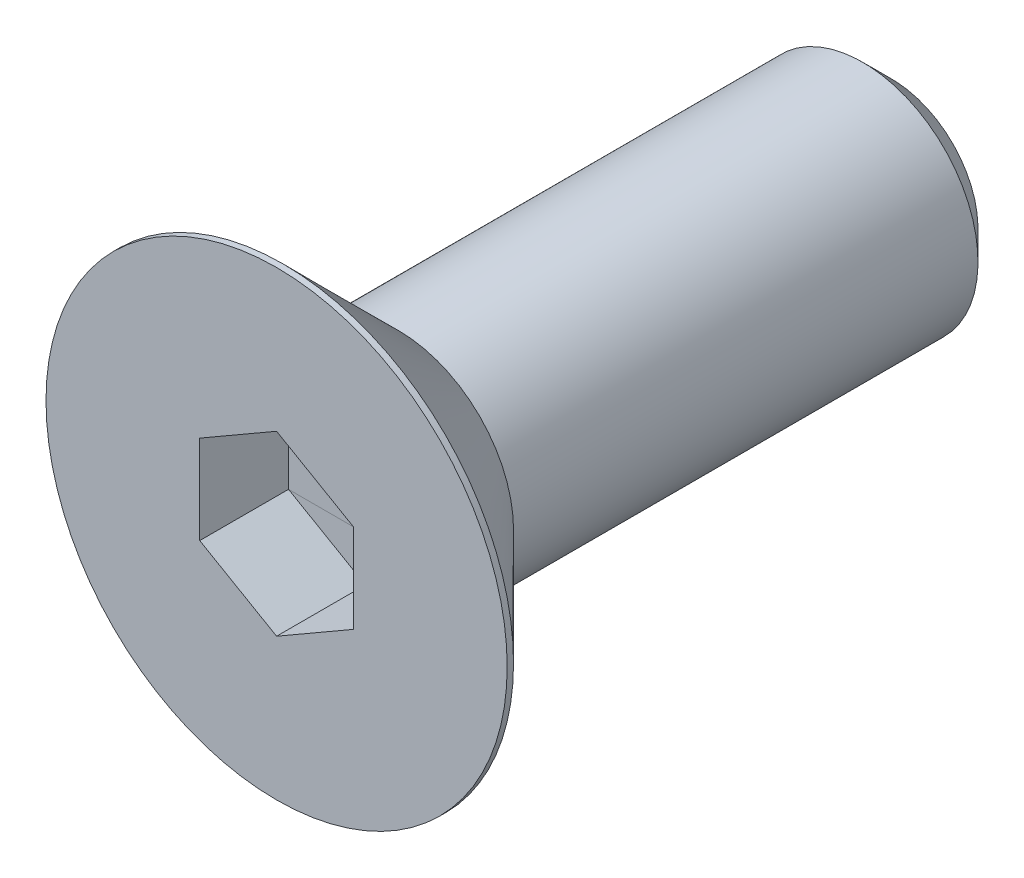
ISO-10303-21;
HEADER;
FILE_DESCRIPTION(('STEP AP214'),'2;1');
FILE_NAME('part.step','',(''),(''),'','','');
FILE_SCHEMA(('AUTOMOTIVE_DESIGN { 1 0 10303 214 1 1 1 1 }'));
ENDSEC;
DATA;
#1=APPLICATION_CONTEXT('core data for automotive mechanical design processes');
#2=APPLICATION_PROTOCOL_DEFINITION('international standard','automotive_design',2000,#1);
#3=PRODUCT_CONTEXT('',#1,'mechanical');
#4=PRODUCT('Part','Part','',(#3));
#5=PRODUCT_RELATED_PRODUCT_CATEGORY('part','',(#4));
#6=PRODUCT_DEFINITION_FORMATION('','',#4);
#7=PRODUCT_DEFINITION_CONTEXT('part definition',#1,'design');
#8=PRODUCT_DEFINITION('design','',#6,#7);
#9=PRODUCT_DEFINITION_SHAPE('','',#8);
#10=(LENGTH_UNIT() NAMED_UNIT(*) SI_UNIT(.MILLI.,.METRE.));
#11=(NAMED_UNIT(*) PLANE_ANGLE_UNIT() SI_UNIT($,.RADIAN.));
#12=(NAMED_UNIT(*) SI_UNIT($,.STERADIAN.) SOLID_ANGLE_UNIT());
#13=UNCERTAINTY_MEASURE_WITH_UNIT(LENGTH_MEASURE(1.E-05),#10,'distance_accuracy_value','');
#14=(GEOMETRIC_REPRESENTATION_CONTEXT(3) GLOBAL_UNCERTAINTY_ASSIGNED_CONTEXT((#13)) GLOBAL_UNIT_ASSIGNED_CONTEXT((#10,
#11,#12)) REPRESENTATION_CONTEXT('',''));
#15=CARTESIAN_POINT('',(0.,0.,0.));
#16=DIRECTION('',(0.,0.,1.));
#17=DIRECTION('',(1.,0.,0.));
#18=AXIS2_PLACEMENT_3D('',#15,#16,#17);
#19=CARTESIAN_POINT('',(0.,0.,7.835));
#20=DIRECTION('',(0.,0.,1.));
#21=DIRECTION('',(0.,-1.,0.));
#22=AXIS2_PLACEMENT_3D('',#19,#20,#21);
#23=CONICAL_SURFACE('',#22,6.,0.785398163397448);
#24=CARTESIAN_POINT('',(0.,0.,4.7));
#25=DIRECTION('',(0.,0.,1.));
#26=DIRECTION('',(0.,-1.,0.));
#27=AXIS2_PLACEMENT_3D('',#24,#25,#26);
#28=CIRCLE('',#27,2.865);
#29=CARTESIAN_POINT('',(0.,-2.865,4.7));
#30=VERTEX_POINT('',#29);
#31=EDGE_CURVE('E150',#30,#30,#28,.T.);
#32=ORIENTED_EDGE('',*,*,#31,.T.);
#33=EDGE_LOOP('',(#32));
#34=FACE_BOUND('',#33,.T.);
#35=CARTESIAN_POINT('',(0.,0.,7.835));
#36=DIRECTION('',(0.,0.,1.));
#37=DIRECTION('',(0.,-1.,0.));
#38=AXIS2_PLACEMENT_3D('',#35,#36,#37);
#39=CIRCLE('',#38,6.);
#40=CARTESIAN_POINT('',(0.,-6.,7.835));
#41=VERTEX_POINT('',#40);
#42=EDGE_CURVE('E12',#41,#41,#39,.T.);
#43=ORIENTED_EDGE('',*,*,#42,.F.);
#44=EDGE_LOOP('',(#43));
#45=FACE_BOUND('',#44,.T.);
#46=ADVANCED_FACE('F49',(#34,#45),#23,.T.);
#47=CARTESIAN_POINT('',(0.,0.,8.));
#48=DIRECTION('',(0.,0.,1.));
#49=DIRECTION('',(0.,-1.,0.));
#50=AXIS2_PLACEMENT_3D('',#47,#48,#49);
#51=CYLINDRICAL_SURFACE('',#50,6.);
#52=ORIENTED_EDGE('',*,*,#42,.T.);
#53=EDGE_LOOP('',(#52));
#54=FACE_BOUND('',#53,.T.);
#55=CARTESIAN_POINT('',(0.,0.,8.));
#56=DIRECTION('',(0.,0.,1.));
#57=DIRECTION('',(0.,-1.,0.));
#58=AXIS2_PLACEMENT_3D('',#55,#56,#57);
#59=CIRCLE('',#58,6.);
#60=CARTESIAN_POINT('',(0.,-6.,8.));
#61=VERTEX_POINT('',#60);
#62=EDGE_CURVE('E56',#61,#61,#59,.T.);
#63=ORIENTED_EDGE('',*,*,#62,.F.);
#64=EDGE_LOOP('',(#63));
#65=FACE_BOUND('',#64,.T.);
#66=ADVANCED_FACE('F162',(#54,#65),#51,.T.);
#67=CARTESIAN_POINT('',(0.,0.,8.));
#68=DIRECTION('',(0.,0.,-1.));
#69=DIRECTION('',(0.,1.,0.));
#70=AXIS2_PLACEMENT_3D('',#67,#68,#69);
#71=PLANE('',#70);
#72=DIRECTION('',(0.,1.,0.));
#73=VECTOR('',#72,1.);
#74=CARTESIAN_POINT('',(2.,-1.15470053837925,8.));
#75=LINE('',#74,#73);
#76=CARTESIAN_POINT('',(2.,-1.15470053837925,8.));
#77=VERTEX_POINT('',#76);
#78=CARTESIAN_POINT('',(2.,1.15470053837925,8.));
#79=VERTEX_POINT('',#78);
#80=EDGE_CURVE('E137',#77,#79,#75,.T.);
#81=ORIENTED_EDGE('',*,*,#80,.F.);
#82=DIRECTION('',(0.866025403784438,0.500000000000001,0.));
#83=VECTOR('',#82,1.);
#84=CARTESIAN_POINT('',(0.,-2.3094010767585,8.));
#85=LINE('',#84,#83);
#86=CARTESIAN_POINT('',(0.,-2.3094010767585,8.));
#87=VERTEX_POINT('',#86);
#88=EDGE_CURVE('E63',#87,#77,#85,.T.);
#89=ORIENTED_EDGE('',*,*,#88,.F.);
#90=DIRECTION('',(0.866025403784438,-0.5,0.));
#91=VECTOR('',#90,1.);
#92=CARTESIAN_POINT('',(-1.99999999999999,-1.15470053837925,8.));
#93=LINE('',#92,#91);
#94=CARTESIAN_POINT('',(-1.99999999999999,-1.15470053837925,8.));
#95=VERTEX_POINT('',#94);
#96=EDGE_CURVE('E146',#95,#87,#93,.T.);
#97=ORIENTED_EDGE('',*,*,#96,.F.);
#98=DIRECTION('',(0.,-1.,0.));
#99=VECTOR('',#98,1.);
#100=CARTESIAN_POINT('',(-1.99999999999999,1.15470053837925,8.));
#101=LINE('',#100,#99);
#102=CARTESIAN_POINT('',(-1.99999999999999,1.15470053837925,8.));
#103=VERTEX_POINT('',#102);
#104=EDGE_CURVE('E144',#103,#95,#101,.T.);
#105=ORIENTED_EDGE('',*,*,#104,.F.);
#106=DIRECTION('',(-0.866025403784439,-0.5,0.));
#107=VECTOR('',#106,1.);
#108=CARTESIAN_POINT('',(0.,2.3094010767585,8.));
#109=LINE('',#108,#107);
#110=CARTESIAN_POINT('',(0.,2.3094010767585,8.));
#111=VERTEX_POINT('',#110);
#112=EDGE_CURVE('E111',#111,#103,#109,.T.);
#113=ORIENTED_EDGE('',*,*,#112,.F.);
#114=DIRECTION('',(-0.866025403784439,0.5,0.));
#115=VECTOR('',#114,1.);
#116=CARTESIAN_POINT('',(2.,1.15470053837925,8.));
#117=LINE('',#116,#115);
#118=EDGE_CURVE('E140',#79,#111,#117,.T.);
#119=ORIENTED_EDGE('',*,*,#118,.F.);
#120=EDGE_LOOP('',(#81,#89,#97,#105,#113,#119));
#121=FACE_BOUND('',#120,.T.);
#122=ORIENTED_EDGE('',*,*,#62,.T.);
#123=EDGE_LOOP('',(#122));
#124=FACE_BOUND('',#123,.T.);
#125=ADVANCED_FACE('F160',(#121,#124),#71,.F.);
#126=CARTESIAN_POINT('',(0.,0.,4.7));
#127=DIRECTION('',(0.,0.,-1.));
#128=DIRECTION('',(0.,1.,0.));
#129=AXIS2_PLACEMENT_3D('',#126,#127,#128);
#130=PLANE('',#129);
#131=ORIENTED_EDGE('',*,*,#31,.F.);
#132=EDGE_LOOP('',(#131));
#133=FACE_BOUND('',#132,.T.);
#134=ADVANCED_FACE('F169',(#133),#130,.T.);
#135=CARTESIAN_POINT('',(0.,-2.3094010767585,5.69));
#136=DIRECTION('',(0.500000000000001,-0.866025403784438,0.));
#137=DIRECTION('',(0.866025403784438,0.500000000000001,0.));
#138=AXIS2_PLACEMENT_3D('',#135,#136,#137);
#139=PLANE('',#138);
#140=ORIENTED_EDGE('',*,*,#88,.T.);
#141=DIRECTION('',(0.,0.,1.));
#142=VECTOR('',#141,1.);
#143=CARTESIAN_POINT('',(2.,-1.15470053837925,5.69));
#144=LINE('',#143,#142);
#145=CARTESIAN_POINT('',(2.,-1.15470053837925,5.69));
#146=VERTEX_POINT('',#145);
#147=EDGE_CURVE('E93',#146,#77,#144,.T.);
#148=ORIENTED_EDGE('',*,*,#147,.F.);
#149=DIRECTION('',(0.866025403784438,0.500000000000001,0.));
#150=VECTOR('',#149,1.);
#151=CARTESIAN_POINT('',(0.,-2.3094010767585,5.69));
#152=LINE('',#151,#150);
#153=CARTESIAN_POINT('',(0.,-2.3094010767585,5.69));
#154=VERTEX_POINT('',#153);
#155=EDGE_CURVE('E148',#154,#146,#152,.T.);
#156=ORIENTED_EDGE('',*,*,#155,.F.);
#157=DIRECTION('',(0.,0.,1.));
#158=VECTOR('',#157,1.);
#159=CARTESIAN_POINT('',(0.,-2.3094010767585,5.69));
#160=LINE('',#159,#158);
#161=EDGE_CURVE('E71',#154,#87,#160,.T.);
#162=ORIENTED_EDGE('',*,*,#161,.T.);
#163=EDGE_LOOP('',(#140,#148,#156,#162));
#164=FACE_BOUND('',#163,.T.);
#165=ADVANCED_FACE('F176',(#164),#139,.F.);
#166=CARTESIAN_POINT('',(-1.99999999999999,-1.15470053837925,5.69));
#167=DIRECTION('',(-0.5,-0.866025403784439,0.));
#168=DIRECTION('',(0.866025403784439,-0.5,0.));
#169=AXIS2_PLACEMENT_3D('',#166,#167,#168);
#170=PLANE('',#169);
#171=ORIENTED_EDGE('',*,*,#96,.T.);
#172=ORIENTED_EDGE('',*,*,#161,.F.);
#173=DIRECTION('',(0.866025403784438,-0.5,0.));
#174=VECTOR('',#173,1.);
#175=CARTESIAN_POINT('',(-1.99999999999999,-1.15470053837925,5.69));
#176=LINE('',#175,#174);
#177=CARTESIAN_POINT('',(-1.99999999999999,-1.15470053837925,5.69));
#178=VERTEX_POINT('',#177);
#179=EDGE_CURVE('E123',#178,#154,#176,.T.);
#180=ORIENTED_EDGE('',*,*,#179,.F.);
#181=DIRECTION('',(0.,0.,1.));
#182=VECTOR('',#181,1.);
#183=CARTESIAN_POINT('',(-1.99999999999999,-1.15470053837925,5.69));
#184=LINE('',#183,#182);
#185=EDGE_CURVE('E115',#178,#95,#184,.T.);
#186=ORIENTED_EDGE('',*,*,#185,.T.);
#187=EDGE_LOOP('',(#171,#172,#180,#186));
#188=FACE_BOUND('',#187,.T.);
#189=ADVANCED_FACE('F180',(#188),#170,.F.);
#190=CARTESIAN_POINT('',(-1.99999999999999,1.15470053837925,5.69));
#191=DIRECTION('',(-1.,0.,0.));
#192=DIRECTION('',(0.,-1.,0.));
#193=AXIS2_PLACEMENT_3D('',#190,#191,#192);
#194=PLANE('',#193);
#195=ORIENTED_EDGE('',*,*,#104,.T.);
#196=ORIENTED_EDGE('',*,*,#185,.F.);
#197=DIRECTION('',(0.,-1.,0.));
#198=VECTOR('',#197,1.);
#199=CARTESIAN_POINT('',(-1.99999999999999,1.15470053837925,5.69));
#200=LINE('',#199,#198);
#201=CARTESIAN_POINT('',(-1.99999999999999,1.15470053837925,5.69));
#202=VERTEX_POINT('',#201);
#203=EDGE_CURVE('E119',#202,#178,#200,.T.);
#204=ORIENTED_EDGE('',*,*,#203,.F.);
#205=DIRECTION('',(0.,0.,1.));
#206=VECTOR('',#205,1.);
#207=CARTESIAN_POINT('',(-1.99999999999999,1.15470053837925,5.69));
#208=LINE('',#207,#206);
#209=EDGE_CURVE('E104',#202,#103,#208,.T.);
#210=ORIENTED_EDGE('',*,*,#209,.T.);
#211=EDGE_LOOP('',(#195,#196,#204,#210));
#212=FACE_BOUND('',#211,.T.);
#213=ADVANCED_FACE('F120',(#212),#194,.F.);
#214=CARTESIAN_POINT('',(0.,2.3094010767585,5.69));
#215=DIRECTION('',(-0.5,0.866025403784439,0.));
#216=DIRECTION('',(-0.866025403784439,-0.5,0.));
#217=AXIS2_PLACEMENT_3D('',#214,#215,#216);
#218=PLANE('',#217);
#219=ORIENTED_EDGE('',*,*,#112,.T.);
#220=ORIENTED_EDGE('',*,*,#209,.F.);
#221=DIRECTION('',(-0.866025403784439,-0.5,0.));
#222=VECTOR('',#221,1.);
#223=CARTESIAN_POINT('',(0.,2.3094010767585,5.69));
#224=LINE('',#223,#222);
#225=CARTESIAN_POINT('',(0.,2.3094010767585,5.69));
#226=VERTEX_POINT('',#225);
#227=EDGE_CURVE('E108',#226,#202,#224,.T.);
#228=ORIENTED_EDGE('',*,*,#227,.F.);
#229=DIRECTION('',(0.,0.,1.));
#230=VECTOR('',#229,1.);
#231=CARTESIAN_POINT('',(0.,2.3094010767585,5.69));
#232=LINE('',#231,#230);
#233=EDGE_CURVE('E116',#226,#111,#232,.T.);
#234=ORIENTED_EDGE('',*,*,#233,.T.);
#235=EDGE_LOOP('',(#219,#220,#228,#234));
#236=FACE_BOUND('',#235,.T.);
#237=ADVANCED_FACE('F106',(#236),#218,.F.);
#238=CARTESIAN_POINT('',(2.,1.15470053837925,5.69));
#239=DIRECTION('',(0.5,0.866025403784439,0.));
#240=DIRECTION('',(-0.866025403784439,0.5,0.));
#241=AXIS2_PLACEMENT_3D('',#238,#239,#240);
#242=PLANE('',#241);
#243=ORIENTED_EDGE('',*,*,#118,.T.);
#244=ORIENTED_EDGE('',*,*,#233,.F.);
#245=DIRECTION('',(-0.866025403784439,0.5,0.));
#246=VECTOR('',#245,1.);
#247=CARTESIAN_POINT('',(2.,1.15470053837925,5.69));
#248=LINE('',#247,#246);
#249=CARTESIAN_POINT('',(2.,1.15470053837925,5.69));
#250=VERTEX_POINT('',#249);
#251=EDGE_CURVE('E129',#250,#226,#248,.T.);
#252=ORIENTED_EDGE('',*,*,#251,.F.);
#253=DIRECTION('',(0.,0.,1.));
#254=VECTOR('',#253,1.);
#255=CARTESIAN_POINT('',(2.,1.15470053837925,5.69));
#256=LINE('',#255,#254);
#257=EDGE_CURVE('E153',#250,#79,#256,.T.);
#258=ORIENTED_EDGE('',*,*,#257,.T.);
#259=EDGE_LOOP('',(#243,#244,#252,#258));
#260=FACE_BOUND('',#259,.T.);
#261=ADVANCED_FACE('F184',(#260),#242,.F.);
#262=CARTESIAN_POINT('',(2.,-1.15470053837925,5.69));
#263=DIRECTION('',(1.,0.,0.));
#264=DIRECTION('',(0.,0.,-1.));
#265=AXIS2_PLACEMENT_3D('',#262,#263,#264);
#266=PLANE('',#265);
#267=ORIENTED_EDGE('',*,*,#80,.T.);
#268=ORIENTED_EDGE('',*,*,#257,.F.);
#269=DIRECTION('',(0.,1.,0.));
#270=VECTOR('',#269,1.);
#271=CARTESIAN_POINT('',(2.,-1.15470053837925,5.69));
#272=LINE('',#271,#270);
#273=EDGE_CURVE('E131',#146,#250,#272,.T.);
#274=ORIENTED_EDGE('',*,*,#273,.F.);
#275=ORIENTED_EDGE('',*,*,#147,.T.);
#276=EDGE_LOOP('',(#267,#268,#274,#275));
#277=FACE_BOUND('',#276,.T.);
#278=ADVANCED_FACE('F181',(#277),#266,.F.);
#279=CARTESIAN_POINT('',(2.,-1.15470053837924,5.69));
#280=DIRECTION('',(0.,0.,1.));
#281=DIRECTION('',(1.,0.,0.));
#282=AXIS2_PLACEMENT_3D('',#279,#280,#281);
#283=PLANE('',#282);
#284=ORIENTED_EDGE('',*,*,#155,.T.);
#285=ORIENTED_EDGE('',*,*,#273,.T.);
#286=ORIENTED_EDGE('',*,*,#251,.T.);
#287=ORIENTED_EDGE('',*,*,#227,.T.);
#288=ORIENTED_EDGE('',*,*,#203,.T.);
#289=ORIENTED_EDGE('',*,*,#179,.T.);
#290=EDGE_LOOP('',(#284,#285,#286,#287,#288,#289));
#291=FACE_BOUND('',#290,.T.);
#292=ADVANCED_FACE('F126',(#291),#283,.T.);
#293=CLOSED_SHELL('',(#46,#66,#125,#134,#165,#189,#213,#237,#261,#278,#292));
#294=MANIFOLD_SOLID_BREP('B2',#293);
#295=CARTESIAN_POINT('',(0.,-3.00000000000001,5.69));
#296=DIRECTION('',(0.,0.,-1.));
#297=DIRECTION('',(0.,1.,0.));
#298=AXIS2_PLACEMENT_3D('',#295,#296,#297);
#299=PLANE('',#298);
#300=CARTESIAN_POINT('',(0.,0.,5.69));
#301=DIRECTION('',(0.,0.,1.));
#302=DIRECTION('',(0.,-1.,0.));
#303=AXIS2_PLACEMENT_3D('',#300,#301,#302);
#304=CIRCLE('',#303,3.00000000000001);
#305=CARTESIAN_POINT('',(0.,-3.00000000000001,5.69));
#306=VERTEX_POINT('',#305);
#307=EDGE_CURVE('E283',#306,#306,#304,.T.);
#308=ORIENTED_EDGE('',*,*,#307,.T.);
#309=EDGE_LOOP('',(#308));
#310=FACE_BOUND('',#309,.T.);
#311=ADVANCED_FACE('F270',(#310),#299,.F.);
#312=CARTESIAN_POINT('',(0.,-3.,-7.99999999999999));
#313=DIRECTION('',(0.,0.,1.));
#314=DIRECTION('',(0.,-1.,0.));
#315=AXIS2_PLACEMENT_3D('',#312,#313,#314);
#316=PLANE('',#315);
#317=CARTESIAN_POINT('',(0.,0.,-7.99999999999999));
#318=DIRECTION('',(0.,0.,1.));
#319=DIRECTION('',(0.,-1.,0.));
#320=AXIS2_PLACEMENT_3D('',#317,#318,#319);
#321=CIRCLE('',#320,2.25);
#322=CARTESIAN_POINT('',(0.,-2.25,-7.99999999999999));
#323=VERTEX_POINT('',#322);
#324=EDGE_CURVE('E48',#323,#323,#321,.F.);
#325=ORIENTED_EDGE('',*,*,#324,.T.);
#326=EDGE_LOOP('',(#325));
#327=FACE_BOUND('',#326,.T.);
#328=ADVANCED_FACE('F294',(#327),#316,.F.);
#329=CARTESIAN_POINT('',(0.,0.,5.69));
#330=DIRECTION('',(0.,0.,1.));
#331=DIRECTION('',(0.,-1.,0.));
#332=AXIS2_PLACEMENT_3D('',#329,#330,#331);
#333=CYLINDRICAL_SURFACE('',#332,3.00000000000001);
#334=CARTESIAN_POINT('',(0.,0.,-7.24999999999999));
#335=DIRECTION('',(0.,0.,1.));
#336=DIRECTION('',(0.,-1.,0.));
#337=AXIS2_PLACEMENT_3D('',#334,#335,#336);
#338=CIRCLE('',#337,3.00000000000001);
#339=CARTESIAN_POINT('',(0.,-3.00000000000001,-7.24999999999999));
#340=VERTEX_POINT('',#339);
#341=EDGE_CURVE('E278',#340,#340,#338,.T.);
#342=ORIENTED_EDGE('',*,*,#341,.T.);
#343=EDGE_LOOP('',(#342));
#344=FACE_BOUND('',#343,.T.);
#345=ORIENTED_EDGE('',*,*,#307,.F.);
#346=EDGE_LOOP('',(#345));
#347=FACE_BOUND('',#346,.T.);
#348=ADVANCED_FACE('F292',(#344,#347),#333,.T.);
#349=CARTESIAN_POINT('',(0.,0.,-7.24999999999999));
#350=DIRECTION('',(0.,0.,1.));
#351=DIRECTION('',(0.,-1.,0.));
#352=AXIS2_PLACEMENT_3D('',#349,#350,#351);
#353=CONICAL_SURFACE('',#352,3.00000000000001,0.785398163397451);
#354=ORIENTED_EDGE('',*,*,#324,.F.);
#355=EDGE_LOOP('',(#354));
#356=FACE_BOUND('',#355,.T.);
#357=ORIENTED_EDGE('',*,*,#341,.F.);
#358=EDGE_LOOP('',(#357));
#359=FACE_BOUND('',#358,.T.);
#360=ADVANCED_FACE('F272',(#356,#359),#353,.T.);
#361=CLOSED_SHELL('',(#311,#328,#348,#360));
#362=MANIFOLD_SOLID_BREP('B6',#361);
#363=ADVANCED_BREP_SHAPE_REPRESENTATION('',(#18,#294,#362),#14);
#364=SHAPE_DEFINITION_REPRESENTATION(#9,#363);
ENDSEC;
END-ISO-10303-21;
